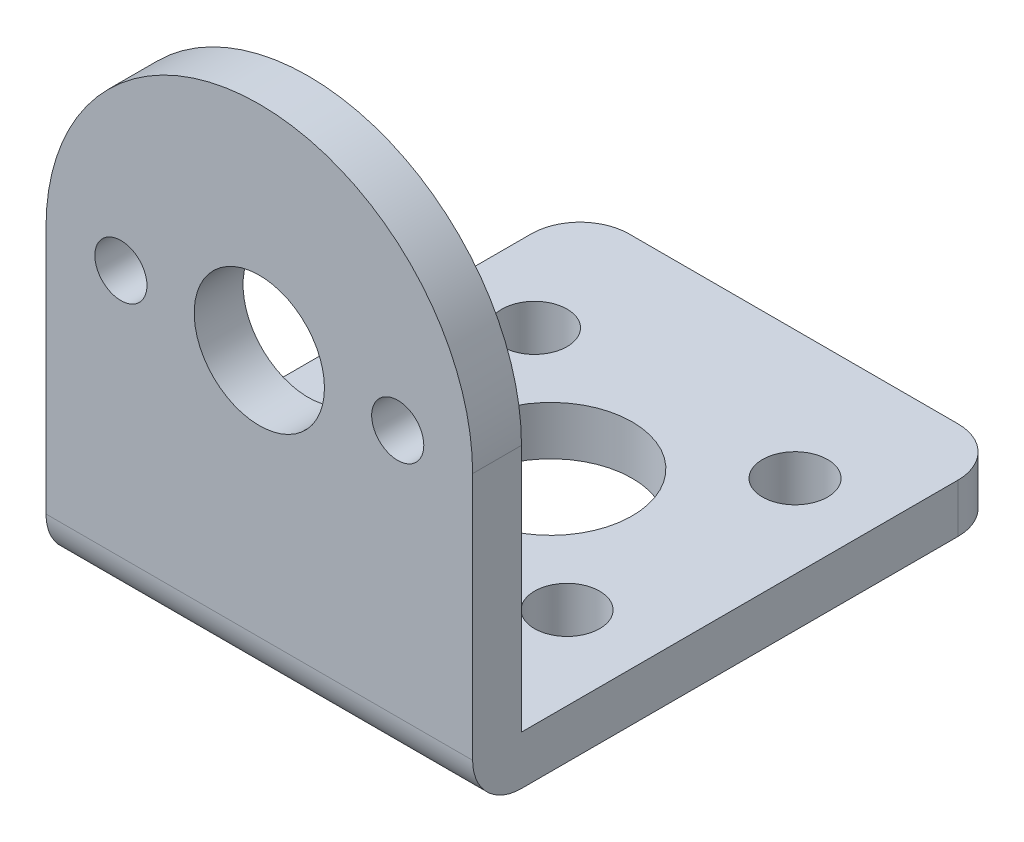
ISO-10303-21;
HEADER;
FILE_DESCRIPTION(('STEP AP214'),'2;1');
FILE_NAME('part.step','',(''),(''),'','','');
FILE_SCHEMA(('AUTOMOTIVE_DESIGN { 1 0 10303 214 1 1 1 1 }'));
ENDSEC;
DATA;
#1=APPLICATION_CONTEXT('core data for automotive mechanical design processes');
#2=APPLICATION_PROTOCOL_DEFINITION('international standard','automotive_design',2000,#1);
#3=PRODUCT_CONTEXT('',#1,'mechanical');
#4=PRODUCT('Part','Part','',(#3));
#5=PRODUCT_RELATED_PRODUCT_CATEGORY('part','',(#4));
#6=PRODUCT_DEFINITION_FORMATION('','',#4);
#7=PRODUCT_DEFINITION_CONTEXT('part definition',#1,'design');
#8=PRODUCT_DEFINITION('design','',#6,#7);
#9=PRODUCT_DEFINITION_SHAPE('','',#8);
#10=(LENGTH_UNIT() NAMED_UNIT(*) SI_UNIT(.MILLI.,.METRE.));
#11=(NAMED_UNIT(*) PLANE_ANGLE_UNIT() SI_UNIT($,.RADIAN.));
#12=(NAMED_UNIT(*) SI_UNIT($,.STERADIAN.) SOLID_ANGLE_UNIT());
#13=UNCERTAINTY_MEASURE_WITH_UNIT(LENGTH_MEASURE(1.E-05),#10,'distance_accuracy_value','');
#14=(GEOMETRIC_REPRESENTATION_CONTEXT(3) GLOBAL_UNCERTAINTY_ASSIGNED_CONTEXT((#13)) GLOBAL_UNIT_ASSIGNED_CONTEXT((#10,
#11,#12)) REPRESENTATION_CONTEXT('',''));
#15=CARTESIAN_POINT('',(0.,0.,0.));
#16=DIRECTION('',(0.,0.,1.));
#17=DIRECTION('',(1.,0.,0.));
#18=AXIS2_PLACEMENT_3D('',#15,#16,#17);
#19=CARTESIAN_POINT('',(0.,0.,0.));
#20=DIRECTION('',(0.,0.,-1.));
#21=DIRECTION('',(-1.,0.,0.));
#22=AXIS2_PLACEMENT_3D('',#19,#20,#21);
#23=PLANE('',#22);
#24=CARTESIAN_POINT('',(-8.5,0.,0.));
#25=DIRECTION('',(0.,0.,1.));
#26=DIRECTION('',(1.,0.,0.));
#27=AXIS2_PLACEMENT_3D('',#24,#25,#26);
#28=CIRCLE('',#27,1.6);
#29=CARTESIAN_POINT('',(-6.9,0.,0.));
#30=VERTEX_POINT('',#29);
#31=EDGE_CURVE('E207',#30,#30,#28,.T.);
#32=ORIENTED_EDGE('',*,*,#31,.T.);
#33=EDGE_LOOP('',(#32));
#34=FACE_BOUND('',#33,.T.);
#35=CARTESIAN_POINT('',(0.,0.,0.));
#36=DIRECTION('',(0.,0.,1.));
#37=DIRECTION('',(1.,0.,0.));
#38=AXIS2_PLACEMENT_3D('',#35,#36,#37);
#39=CIRCLE('',#38,4.);
#40=CARTESIAN_POINT('',(4.,0.,0.));
#41=VERTEX_POINT('',#40);
#42=EDGE_CURVE('E200',#41,#41,#39,.T.);
#43=ORIENTED_EDGE('',*,*,#42,.T.);
#44=EDGE_LOOP('',(#43));
#45=FACE_BOUND('',#44,.T.);
#46=CARTESIAN_POINT('',(8.5,0.,0.));
#47=DIRECTION('',(0.,0.,1.));
#48=DIRECTION('',(1.,0.,0.));
#49=AXIS2_PLACEMENT_3D('',#46,#47,#48);
#50=CIRCLE('',#49,1.6);
#51=CARTESIAN_POINT('',(10.1,0.,0.));
#52=VERTEX_POINT('',#51);
#53=EDGE_CURVE('E122',#52,#52,#50,.T.);
#54=ORIENTED_EDGE('',*,*,#53,.T.);
#55=EDGE_LOOP('',(#54));
#56=FACE_BOUND('',#55,.T.);
#57=DIRECTION('',(0.,1.,0.));
#58=VECTOR('',#57,1.);
#59=CARTESIAN_POINT('',(13.1,-18.25,0.));
#60=LINE('',#59,#58);
#61=CARTESIAN_POINT('',(13.1,-15.25,0.));
#62=VERTEX_POINT('',#61);
#63=CARTESIAN_POINT('',(13.1,0.,0.));
#64=VERTEX_POINT('',#63);
#65=EDGE_CURVE('E111',#62,#64,#60,.T.);
#66=ORIENTED_EDGE('',*,*,#65,.F.);
#67=DIRECTION('',(-1.,0.,0.));
#68=VECTOR('',#67,1.);
#69=CARTESIAN_POINT('',(-13.1,-15.25,0.));
#70=LINE('',#69,#68);
#71=CARTESIAN_POINT('',(-13.1,-15.25,0.));
#72=VERTEX_POINT('',#71);
#73=EDGE_CURVE('E114',#62,#72,#70,.T.);
#74=ORIENTED_EDGE('',*,*,#73,.T.);
#75=DIRECTION('',(0.,-1.,0.));
#76=VECTOR('',#75,1.);
#77=CARTESIAN_POINT('',(-13.1,0.,0.));
#78=LINE('',#77,#76);
#79=CARTESIAN_POINT('',(-13.1,0.,0.));
#80=VERTEX_POINT('',#79);
#81=EDGE_CURVE('E128',#80,#72,#78,.T.);
#82=ORIENTED_EDGE('',*,*,#81,.F.);
#83=CARTESIAN_POINT('',(0.,0.,0.));
#84=DIRECTION('',(0.,0.,1.));
#85=DIRECTION('',(-1.,0.,0.));
#86=AXIS2_PLACEMENT_3D('',#83,#84,#85);
#87=CIRCLE('',#86,13.1);
#88=EDGE_CURVE('E126',#64,#80,#87,.T.);
#89=ORIENTED_EDGE('',*,*,#88,.F.);
#90=EDGE_LOOP('',(#66,#74,#82,#89));
#91=FACE_BOUND('',#90,.T.);
#92=ADVANCED_FACE('F36',(#34,#45,#56,#91),#23,.T.);
#93=CARTESIAN_POINT('',(0.,0.,3.));
#94=DIRECTION('',(0.,0.,-1.));
#95=DIRECTION('',(-1.,0.,0.));
#96=AXIS2_PLACEMENT_3D('',#93,#94,#95);
#97=PLANE('',#96);
#98=DIRECTION('',(0.,-1.,0.));
#99=VECTOR('',#98,1.);
#100=CARTESIAN_POINT('',(-13.1,0.,3.));
#101=LINE('',#100,#99);
#102=CARTESIAN_POINT('',(-13.1,0.,3.));
#103=VERTEX_POINT('',#102);
#104=CARTESIAN_POINT('',(-13.1,-15.25,3.));
#105=VERTEX_POINT('',#104);
#106=EDGE_CURVE('E131',#103,#105,#101,.T.);
#107=ORIENTED_EDGE('',*,*,#106,.T.);
#108=DIRECTION('',(1.,0.,0.));
#109=VECTOR('',#108,1.);
#110=CARTESIAN_POINT('',(0.,-15.25,3.));
#111=LINE('',#110,#109);
#112=CARTESIAN_POINT('',(13.1,-15.25,3.));
#113=VERTEX_POINT('',#112);
#114=EDGE_CURVE('E147',#105,#113,#111,.T.);
#115=ORIENTED_EDGE('',*,*,#114,.T.);
#116=DIRECTION('',(0.,1.,0.));
#117=VECTOR('',#116,1.);
#118=CARTESIAN_POINT('',(13.1,-18.25,3.));
#119=LINE('',#118,#117);
#120=CARTESIAN_POINT('',(13.1,0.,3.));
#121=VERTEX_POINT('',#120);
#122=EDGE_CURVE('E139',#113,#121,#119,.T.);
#123=ORIENTED_EDGE('',*,*,#122,.T.);
#124=CARTESIAN_POINT('',(0.,0.,3.));
#125=DIRECTION('',(0.,0.,1.));
#126=DIRECTION('',(-1.,0.,0.));
#127=AXIS2_PLACEMENT_3D('',#124,#125,#126);
#128=CIRCLE('',#127,13.1);
#129=EDGE_CURVE('E127',#121,#103,#128,.T.);
#130=ORIENTED_EDGE('',*,*,#129,.T.);
#131=EDGE_LOOP('',(#107,#115,#123,#130));
#132=FACE_BOUND('',#131,.T.);
#133=CARTESIAN_POINT('',(0.,0.,3.));
#134=DIRECTION('',(0.,0.,1.));
#135=DIRECTION('',(1.,0.,0.));
#136=AXIS2_PLACEMENT_3D('',#133,#134,#135);
#137=CIRCLE('',#136,4.);
#138=CARTESIAN_POINT('',(4.,0.,3.));
#139=VERTEX_POINT('',#138);
#140=EDGE_CURVE('E197',#139,#139,#137,.T.);
#141=ORIENTED_EDGE('',*,*,#140,.F.);
#142=EDGE_LOOP('',(#141));
#143=FACE_BOUND('',#142,.T.);
#144=CARTESIAN_POINT('',(-8.5,0.,3.));
#145=DIRECTION('',(0.,0.,1.));
#146=DIRECTION('',(1.,0.,0.));
#147=AXIS2_PLACEMENT_3D('',#144,#145,#146);
#148=CIRCLE('',#147,1.6);
#149=CARTESIAN_POINT('',(-6.9,0.,3.));
#150=VERTEX_POINT('',#149);
#151=EDGE_CURVE('E205',#150,#150,#148,.T.);
#152=ORIENTED_EDGE('',*,*,#151,.F.);
#153=EDGE_LOOP('',(#152));
#154=FACE_BOUND('',#153,.T.);
#155=CARTESIAN_POINT('',(8.5,0.,3.));
#156=DIRECTION('',(0.,0.,1.));
#157=DIRECTION('',(1.,0.,0.));
#158=AXIS2_PLACEMENT_3D('',#155,#156,#157);
#159=CIRCLE('',#158,1.6);
#160=CARTESIAN_POINT('',(10.1,0.,3.));
#161=VERTEX_POINT('',#160);
#162=EDGE_CURVE('E210',#161,#161,#159,.T.);
#163=ORIENTED_EDGE('',*,*,#162,.F.);
#164=EDGE_LOOP('',(#163));
#165=FACE_BOUND('',#164,.T.);
#166=ADVANCED_FACE('F189',(#132,#143,#154,#165),#97,.F.);
#167=CARTESIAN_POINT('',(0.,0.,3.));
#168=DIRECTION('',(0.,0.,-1.));
#169=DIRECTION('',(-1.,0.,0.));
#170=AXIS2_PLACEMENT_3D('',#167,#168,#169);
#171=CYLINDRICAL_SURFACE('',#170,13.1);
#172=ORIENTED_EDGE('',*,*,#88,.T.);
#173=DIRECTION('',(0.,0.,-1.));
#174=VECTOR('',#173,1.);
#175=CARTESIAN_POINT('',(-13.1,0.,3.));
#176=LINE('',#175,#174);
#177=EDGE_CURVE('E144',#103,#80,#176,.T.);
#178=ORIENTED_EDGE('',*,*,#177,.F.);
#179=ORIENTED_EDGE('',*,*,#129,.F.);
#180=DIRECTION('',(0.,0.,-1.));
#181=VECTOR('',#180,1.);
#182=CARTESIAN_POINT('',(13.1,0.,3.));
#183=LINE('',#182,#181);
#184=EDGE_CURVE('E136',#121,#64,#183,.T.);
#185=ORIENTED_EDGE('',*,*,#184,.T.);
#186=EDGE_LOOP('',(#172,#178,#179,#185));
#187=FACE_BOUND('',#186,.T.);
#188=ADVANCED_FACE('F290',(#187),#171,.T.);
#189=CARTESIAN_POINT('',(-13.1,0.,3.));
#190=DIRECTION('',(1.,0.,0.));
#191=DIRECTION('',(0.,1.,0.));
#192=AXIS2_PLACEMENT_3D('',#189,#190,#191);
#193=PLANE('',#192);
#194=DIRECTION('',(0.,0.,-1.));
#195=VECTOR('',#194,1.);
#196=CARTESIAN_POINT('',(-13.1,-15.25,0.));
#197=LINE('',#196,#195);
#198=CARTESIAN_POINT('',(-13.1,-15.25,-26.8));
#199=VERTEX_POINT('',#198);
#200=EDGE_CURVE('E119',#72,#199,#197,.T.);
#201=ORIENTED_EDGE('',*,*,#200,.T.);
#202=DIRECTION('',(0.,-1.,0.));
#203=VECTOR('',#202,1.);
#204=CARTESIAN_POINT('',(-13.1,-18.25,-26.8));
#205=LINE('',#204,#203);
#206=CARTESIAN_POINT('',(-13.1,-18.25,-26.8));
#207=VERTEX_POINT('',#206);
#208=EDGE_CURVE('E11',#199,#207,#205,.T.);
#209=ORIENTED_EDGE('',*,*,#208,.T.);
#210=DIRECTION('',(0.,0.,-1.));
#211=VECTOR('',#210,1.);
#212=CARTESIAN_POINT('',(-13.1,-18.25,3.));
#213=LINE('',#212,#211);
#214=CARTESIAN_POINT('',(-13.1,-18.25,0.));
#215=VERTEX_POINT('',#214);
#216=EDGE_CURVE('E141',#215,#207,#213,.T.);
#217=ORIENTED_EDGE('',*,*,#216,.F.);
#218=CARTESIAN_POINT('',(-13.1,-15.25,0.));
#219=DIRECTION('',(1.,0.,0.));
#220=DIRECTION('',(0.,1.,0.));
#221=AXIS2_PLACEMENT_3D('',#218,#219,#220);
#222=CIRCLE('',#221,3.);
#223=EDGE_CURVE('E154',#215,#105,#222,.F.);
#224=ORIENTED_EDGE('',*,*,#223,.T.);
#225=ORIENTED_EDGE('',*,*,#106,.F.);
#226=ORIENTED_EDGE('',*,*,#177,.T.);
#227=ORIENTED_EDGE('',*,*,#81,.T.);
#228=EDGE_LOOP('',(#201,#209,#217,#224,#225,#226,#227));
#229=FACE_BOUND('',#228,.T.);
#230=ADVANCED_FACE('F260',(#229),#193,.F.);
#231=CARTESIAN_POINT('',(-13.1,-18.25,3.));
#232=DIRECTION('',(0.,1.,0.));
#233=DIRECTION('',(0.,0.,1.));
#234=AXIS2_PLACEMENT_3D('',#231,#232,#233);
#235=PLANE('',#234);
#236=DIRECTION('',(1.,0.,0.));
#237=VECTOR('',#236,1.);
#238=CARTESIAN_POINT('',(-13.1,-18.25,-29.8));
#239=LINE('',#238,#237);
#240=CARTESIAN_POINT('',(-10.1,-18.25,-29.8));
#241=VERTEX_POINT('',#240);
#242=CARTESIAN_POINT('',(10.1,-18.25,-29.8));
#243=VERTEX_POINT('',#242);
#244=EDGE_CURVE('E181',#241,#243,#239,.T.);
#245=ORIENTED_EDGE('',*,*,#244,.T.);
#246=CARTESIAN_POINT('',(10.1,-18.25,-26.8));
#247=DIRECTION('',(0.,1.,0.));
#248=DIRECTION('',(0.,0.,1.));
#249=AXIS2_PLACEMENT_3D('',#246,#247,#248);
#250=CIRCLE('',#249,3.);
#251=CARTESIAN_POINT('',(13.1,-18.25,-26.8));
#252=VERTEX_POINT('',#251);
#253=EDGE_CURVE('E163',#243,#252,#250,.F.);
#254=ORIENTED_EDGE('',*,*,#253,.T.);
#255=DIRECTION('',(0.,0.,-1.));
#256=VECTOR('',#255,1.);
#257=CARTESIAN_POINT('',(13.1,-18.25,3.));
#258=LINE('',#257,#256);
#259=CARTESIAN_POINT('',(13.1,-18.25,0.));
#260=VERTEX_POINT('',#259);
#261=EDGE_CURVE('E138',#260,#252,#258,.T.);
#262=ORIENTED_EDGE('',*,*,#261,.F.);
#263=DIRECTION('',(1.,0.,0.));
#264=VECTOR('',#263,1.);
#265=CARTESIAN_POINT('',(-13.1,-18.25,0.));
#266=LINE('',#265,#264);
#267=EDGE_CURVE('E152',#260,#215,#266,.F.);
#268=ORIENTED_EDGE('',*,*,#267,.T.);
#269=ORIENTED_EDGE('',*,*,#216,.T.);
#270=CARTESIAN_POINT('',(-10.1,-18.25,-26.8));
#271=DIRECTION('',(0.,1.,0.));
#272=DIRECTION('',(0.,0.,1.));
#273=AXIS2_PLACEMENT_3D('',#270,#271,#272);
#274=CIRCLE('',#273,3.);
#275=EDGE_CURVE('E161',#207,#241,#274,.F.);
#276=ORIENTED_EDGE('',*,*,#275,.T.);
#277=EDGE_LOOP('',(#245,#254,#262,#268,#269,#276));
#278=FACE_BOUND('',#277,.T.);
#279=CARTESIAN_POINT('',(-8.00000000000002,-18.25,-7.90000000000015));
#280=DIRECTION('',(0.,-1.,0.));
#281=DIRECTION('',(0.,0.,-1.));
#282=AXIS2_PLACEMENT_3D('',#279,#280,#281);
#283=CIRCLE('',#282,2.);
#284=CARTESIAN_POINT('',(-8.00000000000002,-18.25,-9.90000000000015));
#285=VERTEX_POINT('',#284);
#286=EDGE_CURVE('E244',#285,#285,#283,.T.);
#287=ORIENTED_EDGE('',*,*,#286,.F.);
#288=EDGE_LOOP('',(#287));
#289=FACE_BOUND('',#288,.T.);
#290=CARTESIAN_POINT('',(7.99999999999998,-18.25,-7.90000000000004));
#291=DIRECTION('',(0.,-1.,0.));
#292=DIRECTION('',(0.,0.,-1.));
#293=AXIS2_PLACEMENT_3D('',#290,#291,#292);
#294=CIRCLE('',#293,2.);
#295=CARTESIAN_POINT('',(7.99999999999998,-18.25,-9.90000000000004));
#296=VERTEX_POINT('',#295);
#297=EDGE_CURVE('E238',#296,#296,#294,.T.);
#298=ORIENTED_EDGE('',*,*,#297,.F.);
#299=EDGE_LOOP('',(#298));
#300=FACE_BOUND('',#299,.T.);
#301=CARTESIAN_POINT('',(-7.99999999999992,-18.25,-21.9000000000002));
#302=DIRECTION('',(0.,-1.,0.));
#303=DIRECTION('',(0.,0.,-1.));
#304=AXIS2_PLACEMENT_3D('',#301,#302,#303);
#305=CIRCLE('',#304,2.);
#306=CARTESIAN_POINT('',(-7.99999999999992,-18.25,-23.9000000000002));
#307=VERTEX_POINT('',#306);
#308=EDGE_CURVE('E232',#307,#307,#305,.T.);
#309=ORIENTED_EDGE('',*,*,#308,.F.);
#310=EDGE_LOOP('',(#309));
#311=FACE_BOUND('',#310,.T.);
#312=CARTESIAN_POINT('',(8.00000000000008,-18.25,-21.9));
#313=DIRECTION('',(0.,-1.,0.));
#314=DIRECTION('',(0.,0.,-1.));
#315=AXIS2_PLACEMENT_3D('',#312,#313,#314);
#316=CIRCLE('',#315,2.);
#317=CARTESIAN_POINT('',(8.00000000000008,-18.25,-23.9));
#318=VERTEX_POINT('',#317);
#319=EDGE_CURVE('E226',#318,#318,#316,.T.);
#320=ORIENTED_EDGE('',*,*,#319,.F.);
#321=EDGE_LOOP('',(#320));
#322=FACE_BOUND('',#321,.T.);
#323=CARTESIAN_POINT('',(0.,-18.25,-14.9000000000001));
#324=DIRECTION('',(0.,-1.,0.));
#325=DIRECTION('',(0.,0.,-1.));
#326=AXIS2_PLACEMENT_3D('',#323,#324,#325);
#327=CIRCLE('',#326,5.);
#328=CARTESIAN_POINT('',(0.,-18.25,-19.9000000000001));
#329=VERTEX_POINT('',#328);
#330=EDGE_CURVE('E220',#329,#329,#327,.T.);
#331=ORIENTED_EDGE('',*,*,#330,.F.);
#332=EDGE_LOOP('',(#331));
#333=FACE_BOUND('',#332,.T.);
#334=ADVANCED_FACE('F178',(#278,#289,#300,#311,#322,#333),#235,.F.);
#335=CARTESIAN_POINT('',(13.1,-18.25,3.));
#336=DIRECTION('',(-1.,0.,0.));
#337=DIRECTION('',(0.,-1.,0.));
#338=AXIS2_PLACEMENT_3D('',#335,#336,#337);
#339=PLANE('',#338);
#340=ORIENTED_EDGE('',*,*,#261,.T.);
#341=DIRECTION('',(0.,-1.,0.));
#342=VECTOR('',#341,1.);
#343=CARTESIAN_POINT('',(13.1,-15.25,-26.8));
#344=LINE('',#343,#342);
#345=CARTESIAN_POINT('',(13.1,-15.25,-26.8));
#346=VERTEX_POINT('',#345);
#347=EDGE_CURVE('E59',#252,#346,#344,.F.);
#348=ORIENTED_EDGE('',*,*,#347,.T.);
#349=DIRECTION('',(0.,0.,1.));
#350=VECTOR('',#349,1.);
#351=CARTESIAN_POINT('',(13.1,-15.25,0.));
#352=LINE('',#351,#350);
#353=EDGE_CURVE('E106',#346,#62,#352,.T.);
#354=ORIENTED_EDGE('',*,*,#353,.T.);
#355=ORIENTED_EDGE('',*,*,#65,.T.);
#356=ORIENTED_EDGE('',*,*,#184,.F.);
#357=ORIENTED_EDGE('',*,*,#122,.F.);
#358=CARTESIAN_POINT('',(13.1,-15.25,0.));
#359=DIRECTION('',(-1.,0.,0.));
#360=DIRECTION('',(0.,-1.,0.));
#361=AXIS2_PLACEMENT_3D('',#358,#359,#360);
#362=CIRCLE('',#361,3.);
#363=EDGE_CURVE('E150',#113,#260,#362,.F.);
#364=ORIENTED_EDGE('',*,*,#363,.T.);
#365=EDGE_LOOP('',(#340,#348,#354,#355,#356,#357,#364));
#366=FACE_BOUND('',#365,.T.);
#367=ADVANCED_FACE('F108',(#366),#339,.F.);
#368=CARTESIAN_POINT('',(0.,0.,3.));
#369=DIRECTION('',(0.,0.,-1.));
#370=DIRECTION('',(-1.,0.,0.));
#371=AXIS2_PLACEMENT_3D('',#368,#369,#370);
#372=CYLINDRICAL_SURFACE('',#371,4.);
#373=ORIENTED_EDGE('',*,*,#140,.T.);
#374=EDGE_LOOP('',(#373));
#375=FACE_BOUND('',#374,.T.);
#376=ORIENTED_EDGE('',*,*,#42,.F.);
#377=EDGE_LOOP('',(#376));
#378=FACE_BOUND('',#377,.T.);
#379=ADVANCED_FACE('F296',(#375,#378),#372,.F.);
#380=CARTESIAN_POINT('',(-8.5,0.,3.));
#381=DIRECTION('',(0.,0.,-1.));
#382=DIRECTION('',(-1.,0.,0.));
#383=AXIS2_PLACEMENT_3D('',#380,#381,#382);
#384=CYLINDRICAL_SURFACE('',#383,1.6);
#385=ORIENTED_EDGE('',*,*,#151,.T.);
#386=EDGE_LOOP('',(#385));
#387=FACE_BOUND('',#386,.T.);
#388=ORIENTED_EDGE('',*,*,#31,.F.);
#389=EDGE_LOOP('',(#388));
#390=FACE_BOUND('',#389,.T.);
#391=ADVANCED_FACE('F413',(#387,#390),#384,.F.);
#392=CARTESIAN_POINT('',(8.5,0.,3.));
#393=DIRECTION('',(0.,0.,-1.));
#394=DIRECTION('',(-1.,0.,0.));
#395=AXIS2_PLACEMENT_3D('',#392,#393,#394);
#396=CYLINDRICAL_SURFACE('',#395,1.6);
#397=ORIENTED_EDGE('',*,*,#162,.T.);
#398=EDGE_LOOP('',(#397));
#399=FACE_BOUND('',#398,.T.);
#400=ORIENTED_EDGE('',*,*,#53,.F.);
#401=EDGE_LOOP('',(#400));
#402=FACE_BOUND('',#401,.T.);
#403=ADVANCED_FACE('F333',(#399,#402),#396,.F.);
#404=CARTESIAN_POINT('',(-13.1,-15.25,-29.8));
#405=DIRECTION('',(0.,0.,-1.));
#406=DIRECTION('',(-1.,0.,0.));
#407=AXIS2_PLACEMENT_3D('',#404,#405,#406);
#408=PLANE('',#407);
#409=DIRECTION('',(1.,0.,0.));
#410=VECTOR('',#409,1.);
#411=CARTESIAN_POINT('',(-13.1,-15.25,-29.8));
#412=LINE('',#411,#410);
#413=CARTESIAN_POINT('',(-10.1,-15.25,-29.8));
#414=VERTEX_POINT('',#413);
#415=CARTESIAN_POINT('',(10.1,-15.25,-29.8));
#416=VERTEX_POINT('',#415);
#417=EDGE_CURVE('E115',#414,#416,#412,.T.);
#418=ORIENTED_EDGE('',*,*,#417,.T.);
#419=DIRECTION('',(0.,-1.,0.));
#420=VECTOR('',#419,1.);
#421=CARTESIAN_POINT('',(10.1,-18.25,-29.8));
#422=LINE('',#421,#420);
#423=EDGE_CURVE('E158',#416,#243,#422,.T.);
#424=ORIENTED_EDGE('',*,*,#423,.T.);
#425=ORIENTED_EDGE('',*,*,#244,.F.);
#426=DIRECTION('',(0.,-1.,0.));
#427=VECTOR('',#426,1.);
#428=CARTESIAN_POINT('',(-10.1,-15.25,-29.8));
#429=LINE('',#428,#427);
#430=EDGE_CURVE('E156',#241,#414,#429,.F.);
#431=ORIENTED_EDGE('',*,*,#430,.T.);
#432=EDGE_LOOP('',(#418,#424,#425,#431));
#433=FACE_BOUND('',#432,.T.);
#434=ADVANCED_FACE('F170',(#433),#408,.T.);
#435=CARTESIAN_POINT('',(0.,-15.25,0.));
#436=DIRECTION('',(0.,-1.,0.));
#437=DIRECTION('',(0.,0.,-1.));
#438=AXIS2_PLACEMENT_3D('',#435,#436,#437);
#439=PLANE('',#438);
#440=CARTESIAN_POINT('',(-8.00000000000002,-15.25,-7.90000000000015));
#441=DIRECTION('',(0.,-1.,0.));
#442=DIRECTION('',(0.,0.,-1.));
#443=AXIS2_PLACEMENT_3D('',#440,#441,#442);
#444=CIRCLE('',#443,2.);
#445=CARTESIAN_POINT('',(-8.00000000000002,-15.25,-9.90000000000015));
#446=VERTEX_POINT('',#445);
#447=EDGE_CURVE('E241',#446,#446,#444,.T.);
#448=ORIENTED_EDGE('',*,*,#447,.T.);
#449=EDGE_LOOP('',(#448));
#450=FACE_BOUND('',#449,.T.);
#451=CARTESIAN_POINT('',(7.99999999999998,-15.25,-7.90000000000004));
#452=DIRECTION('',(0.,-1.,0.));
#453=DIRECTION('',(0.,0.,-1.));
#454=AXIS2_PLACEMENT_3D('',#451,#452,#453);
#455=CIRCLE('',#454,2.);
#456=CARTESIAN_POINT('',(7.99999999999998,-15.25,-9.90000000000004));
#457=VERTEX_POINT('',#456);
#458=EDGE_CURVE('E235',#457,#457,#455,.T.);
#459=ORIENTED_EDGE('',*,*,#458,.T.);
#460=EDGE_LOOP('',(#459));
#461=FACE_BOUND('',#460,.T.);
#462=CARTESIAN_POINT('',(-7.99999999999992,-15.25,-21.9000000000002));
#463=DIRECTION('',(0.,-1.,0.));
#464=DIRECTION('',(0.,0.,-1.));
#465=AXIS2_PLACEMENT_3D('',#462,#463,#464);
#466=CIRCLE('',#465,2.);
#467=CARTESIAN_POINT('',(-7.99999999999992,-15.25,-23.9000000000002));
#468=VERTEX_POINT('',#467);
#469=EDGE_CURVE('E229',#468,#468,#466,.T.);
#470=ORIENTED_EDGE('',*,*,#469,.T.);
#471=EDGE_LOOP('',(#470));
#472=FACE_BOUND('',#471,.T.);
#473=CARTESIAN_POINT('',(8.00000000000008,-15.25,-21.9));
#474=DIRECTION('',(0.,-1.,0.));
#475=DIRECTION('',(0.,0.,-1.));
#476=AXIS2_PLACEMENT_3D('',#473,#474,#475);
#477=CIRCLE('',#476,2.);
#478=CARTESIAN_POINT('',(8.00000000000008,-15.25,-23.9));
#479=VERTEX_POINT('',#478);
#480=EDGE_CURVE('E223',#479,#479,#477,.T.);
#481=ORIENTED_EDGE('',*,*,#480,.T.);
#482=EDGE_LOOP('',(#481));
#483=FACE_BOUND('',#482,.T.);
#484=CARTESIAN_POINT('',(0.,-15.25,-14.9000000000001));
#485=DIRECTION('',(0.,-1.,0.));
#486=DIRECTION('',(0.,0.,-1.));
#487=AXIS2_PLACEMENT_3D('',#484,#485,#486);
#488=CIRCLE('',#487,5.);
#489=CARTESIAN_POINT('',(0.,-15.25,-19.9000000000001));
#490=VERTEX_POINT('',#489);
#491=EDGE_CURVE('E217',#490,#490,#488,.T.);
#492=ORIENTED_EDGE('',*,*,#491,.T.);
#493=EDGE_LOOP('',(#492));
#494=FACE_BOUND('',#493,.T.);
#495=ORIENTED_EDGE('',*,*,#353,.F.);
#496=CARTESIAN_POINT('',(10.1,-15.25,-26.8));
#497=DIRECTION('',(0.,-1.,0.));
#498=DIRECTION('',(0.,0.,-1.));
#499=AXIS2_PLACEMENT_3D('',#496,#497,#498);
#500=CIRCLE('',#499,3.);
#501=EDGE_CURVE('E44',#346,#416,#500,.F.);
#502=ORIENTED_EDGE('',*,*,#501,.T.);
#503=ORIENTED_EDGE('',*,*,#417,.F.);
#504=CARTESIAN_POINT('',(-10.1,-15.25,-26.8));
#505=DIRECTION('',(0.,-1.,0.));
#506=DIRECTION('',(0.,0.,-1.));
#507=AXIS2_PLACEMENT_3D('',#504,#505,#506);
#508=CIRCLE('',#507,3.);
#509=EDGE_CURVE('E51',#414,#199,#508,.F.);
#510=ORIENTED_EDGE('',*,*,#509,.T.);
#511=ORIENTED_EDGE('',*,*,#200,.F.);
#512=ORIENTED_EDGE('',*,*,#73,.F.);
#513=EDGE_LOOP('',(#495,#502,#503,#510,#511,#512));
#514=FACE_BOUND('',#513,.T.);
#515=ADVANCED_FACE('F118',(#450,#461,#472,#483,#494,#514),#439,.F.);
#516=CARTESIAN_POINT('',(0.,-15.25,-14.9000000000001));
#517=DIRECTION('',(0.,-1.,0.));
#518=DIRECTION('',(0.,0.,-1.));
#519=AXIS2_PLACEMENT_3D('',#516,#517,#518);
#520=CYLINDRICAL_SURFACE('',#519,5.);
#521=ORIENTED_EDGE('',*,*,#491,.F.);
#522=EDGE_LOOP('',(#521));
#523=FACE_BOUND('',#522,.T.);
#524=ORIENTED_EDGE('',*,*,#330,.T.);
#525=EDGE_LOOP('',(#524));
#526=FACE_BOUND('',#525,.T.);
#527=ADVANCED_FACE('F270',(#523,#526),#520,.F.);
#528=CARTESIAN_POINT('',(8.00000000000008,-15.25,-21.9));
#529=DIRECTION('',(0.,-1.,0.));
#530=DIRECTION('',(0.,0.,-1.));
#531=AXIS2_PLACEMENT_3D('',#528,#529,#530);
#532=CYLINDRICAL_SURFACE('',#531,2.);
#533=ORIENTED_EDGE('',*,*,#480,.F.);
#534=EDGE_LOOP('',(#533));
#535=FACE_BOUND('',#534,.T.);
#536=ORIENTED_EDGE('',*,*,#319,.T.);
#537=EDGE_LOOP('',(#536));
#538=FACE_BOUND('',#537,.T.);
#539=ADVANCED_FACE('F272',(#535,#538),#532,.F.);
#540=CARTESIAN_POINT('',(-7.99999999999992,-15.25,-21.9000000000002));
#541=DIRECTION('',(0.,-1.,0.));
#542=DIRECTION('',(0.,0.,-1.));
#543=AXIS2_PLACEMENT_3D('',#540,#541,#542);
#544=CYLINDRICAL_SURFACE('',#543,2.);
#545=ORIENTED_EDGE('',*,*,#469,.F.);
#546=EDGE_LOOP('',(#545));
#547=FACE_BOUND('',#546,.T.);
#548=ORIENTED_EDGE('',*,*,#308,.T.);
#549=EDGE_LOOP('',(#548));
#550=FACE_BOUND('',#549,.T.);
#551=ADVANCED_FACE('F279',(#547,#550),#544,.F.);
#552=CARTESIAN_POINT('',(7.99999999999998,-15.25,-7.90000000000004));
#553=DIRECTION('',(0.,-1.,0.));
#554=DIRECTION('',(0.,0.,-1.));
#555=AXIS2_PLACEMENT_3D('',#552,#553,#554);
#556=CYLINDRICAL_SURFACE('',#555,2.);
#557=ORIENTED_EDGE('',*,*,#458,.F.);
#558=EDGE_LOOP('',(#557));
#559=FACE_BOUND('',#558,.T.);
#560=ORIENTED_EDGE('',*,*,#297,.T.);
#561=EDGE_LOOP('',(#560));
#562=FACE_BOUND('',#561,.T.);
#563=ADVANCED_FACE('F255',(#559,#562),#556,.F.);
#564=CARTESIAN_POINT('',(-8.00000000000002,-15.25,-7.90000000000015));
#565=DIRECTION('',(0.,-1.,0.));
#566=DIRECTION('',(0.,0.,-1.));
#567=AXIS2_PLACEMENT_3D('',#564,#565,#566);
#568=CYLINDRICAL_SURFACE('',#567,2.);
#569=ORIENTED_EDGE('',*,*,#447,.F.);
#570=EDGE_LOOP('',(#569));
#571=FACE_BOUND('',#570,.T.);
#572=ORIENTED_EDGE('',*,*,#286,.T.);
#573=EDGE_LOOP('',(#572));
#574=FACE_BOUND('',#573,.T.);
#575=ADVANCED_FACE('F252',(#571,#574),#568,.F.);
#576=CARTESIAN_POINT('',(0.,-15.25,0.));
#577=DIRECTION('',(1.,0.,0.));
#578=DIRECTION('',(0.,0.,-1.));
#579=AXIS2_PLACEMENT_3D('',#576,#577,#578);
#580=CYLINDRICAL_SURFACE('',#579,3.);
#581=ORIENTED_EDGE('',*,*,#223,.F.);
#582=ORIENTED_EDGE('',*,*,#267,.F.);
#583=ORIENTED_EDGE('',*,*,#363,.F.);
#584=ORIENTED_EDGE('',*,*,#114,.F.);
#585=EDGE_LOOP('',(#581,#582,#583,#584));
#586=FACE_BOUND('',#585,.T.);
#587=ADVANCED_FACE('F186',(#586),#580,.T.);
#588=CARTESIAN_POINT('',(10.1,-15.25,-26.8));
#589=DIRECTION('',(0.,1.,0.));
#590=DIRECTION('',(-1.,0.,0.));
#591=AXIS2_PLACEMENT_3D('',#588,#589,#590);
#592=CYLINDRICAL_SURFACE('',#591,3.);
#593=ORIENTED_EDGE('',*,*,#501,.F.);
#594=ORIENTED_EDGE('',*,*,#347,.F.);
#595=ORIENTED_EDGE('',*,*,#253,.F.);
#596=ORIENTED_EDGE('',*,*,#423,.F.);
#597=EDGE_LOOP('',(#593,#594,#595,#596));
#598=FACE_BOUND('',#597,.T.);
#599=ADVANCED_FACE('F175',(#598),#592,.T.);
#600=CARTESIAN_POINT('',(-10.1,0.,-26.8));
#601=DIRECTION('',(0.,1.,0.));
#602=DIRECTION('',(-1.,0.,0.));
#603=AXIS2_PLACEMENT_3D('',#600,#601,#602);
#604=CYLINDRICAL_SURFACE('',#603,3.);
#605=ORIENTED_EDGE('',*,*,#509,.F.);
#606=ORIENTED_EDGE('',*,*,#430,.F.);
#607=ORIENTED_EDGE('',*,*,#275,.F.);
#608=ORIENTED_EDGE('',*,*,#208,.F.);
#609=EDGE_LOOP('',(#605,#606,#607,#608));
#610=FACE_BOUND('',#609,.T.);
#611=ADVANCED_FACE('F38',(#610),#604,.T.);
#612=CLOSED_SHELL('',(#92,#166,#188,#230,#334,#367,#379,#391,#403,#434,#515,#527,#539,#551,#563,
#575,#587,#599,#611));
#613=MANIFOLD_SOLID_BREP('B2',#612);
#614=ADVANCED_BREP_SHAPE_REPRESENTATION('',(#18,#613),#14);
#615=SHAPE_DEFINITION_REPRESENTATION(#9,#614);
ENDSEC;
END-ISO-10303-21;
